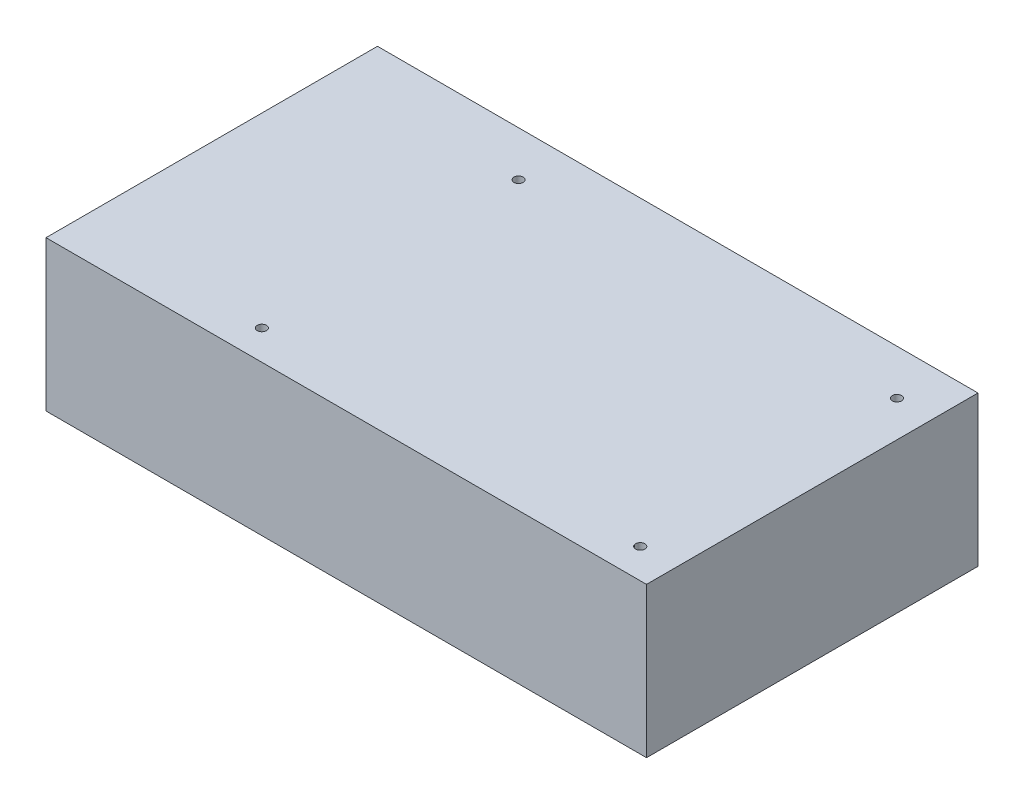
ISO-10303-21;
HEADER;
FILE_DESCRIPTION(('STEP AP214'),'2;1');
FILE_NAME('part.step','',(''),(''),'','','');
FILE_SCHEMA(('AUTOMOTIVE_DESIGN { 1 0 10303 214 1 1 1 1 }'));
ENDSEC;
DATA;
#1=APPLICATION_CONTEXT('core data for automotive mechanical design processes');
#2=APPLICATION_PROTOCOL_DEFINITION('international standard','automotive_design',2000,#1);
#3=PRODUCT_CONTEXT('',#1,'mechanical');
#4=PRODUCT('Part','Part','',(#3));
#5=PRODUCT_RELATED_PRODUCT_CATEGORY('part','',(#4));
#6=PRODUCT_DEFINITION_FORMATION('','',#4);
#7=PRODUCT_DEFINITION_CONTEXT('part definition',#1,'design');
#8=PRODUCT_DEFINITION('design','',#6,#7);
#9=PRODUCT_DEFINITION_SHAPE('','',#8);
#10=(LENGTH_UNIT() NAMED_UNIT(*) SI_UNIT(.MILLI.,.METRE.));
#11=(NAMED_UNIT(*) PLANE_ANGLE_UNIT() SI_UNIT($,.RADIAN.));
#12=(NAMED_UNIT(*) SI_UNIT($,.STERADIAN.) SOLID_ANGLE_UNIT());
#13=UNCERTAINTY_MEASURE_WITH_UNIT(LENGTH_MEASURE(1.E-05),#10,'distance_accuracy_value','');
#14=(GEOMETRIC_REPRESENTATION_CONTEXT(3) GLOBAL_UNCERTAINTY_ASSIGNED_CONTEXT((#13)) GLOBAL_UNIT_ASSIGNED_CONTEXT((#10,
#11,#12)) REPRESENTATION_CONTEXT('',''));
#15=CARTESIAN_POINT('',(0.,0.,0.));
#16=DIRECTION('',(0.,0.,1.));
#17=DIRECTION('',(1.,0.,0.));
#18=AXIS2_PLACEMENT_3D('',#15,#16,#17);
#19=CARTESIAN_POINT('',(0.,50.,0.));
#20=DIRECTION('',(1.,0.,0.));
#21=DIRECTION('',(0.,0.,-1.));
#22=AXIS2_PLACEMENT_3D('',#19,#20,#21);
#23=PLANE('',#22);
#24=DIRECTION('',(0.,0.,1.));
#25=VECTOR('',#24,1.);
#26=CARTESIAN_POINT('',(0.,0.,0.));
#27=LINE('',#26,#25);
#28=CARTESIAN_POINT('',(0.,0.,-110.4));
#29=VERTEX_POINT('',#28);
#30=CARTESIAN_POINT('',(0.,0.,0.));
#31=VERTEX_POINT('',#30);
#32=EDGE_CURVE('E98',#29,#31,#27,.T.);
#33=ORIENTED_EDGE('',*,*,#32,.T.);
#34=DIRECTION('',(0.,-1.,0.));
#35=VECTOR('',#34,1.);
#36=CARTESIAN_POINT('',(0.,50.,0.));
#37=LINE('',#36,#35);
#38=CARTESIAN_POINT('',(0.,50.,0.));
#39=VERTEX_POINT('',#38);
#40=EDGE_CURVE('E11',#39,#31,#37,.T.);
#41=ORIENTED_EDGE('',*,*,#40,.F.);
#42=DIRECTION('',(0.,0.,1.));
#43=VECTOR('',#42,1.);
#44=CARTESIAN_POINT('',(0.,50.,0.));
#45=LINE('',#44,#43);
#46=CARTESIAN_POINT('',(0.,50.,-110.4));
#47=VERTEX_POINT('',#46);
#48=EDGE_CURVE('E86',#47,#39,#45,.T.);
#49=ORIENTED_EDGE('',*,*,#48,.F.);
#50=DIRECTION('',(0.,-1.,0.));
#51=VECTOR('',#50,1.);
#52=CARTESIAN_POINT('',(0.,50.,-110.4));
#53=LINE('',#52,#51);
#54=EDGE_CURVE('E94',#47,#29,#53,.T.);
#55=ORIENTED_EDGE('',*,*,#54,.T.);
#56=EDGE_LOOP('',(#33,#41,#49,#55));
#57=FACE_BOUND('',#56,.T.);
#58=ADVANCED_FACE('F35',(#57),#23,.F.);
#59=CARTESIAN_POINT('',(0.,50.,0.));
#60=DIRECTION('',(0.,0.,-1.));
#61=DIRECTION('',(-1.,0.,0.));
#62=AXIS2_PLACEMENT_3D('',#59,#60,#61);
#63=PLANE('',#62);
#64=DIRECTION('',(1.,0.,0.));
#65=VECTOR('',#64,1.);
#66=CARTESIAN_POINT('',(0.,0.,0.));
#67=LINE('',#66,#65);
#68=CARTESIAN_POINT('',(200.,0.,0.));
#69=VERTEX_POINT('',#68);
#70=EDGE_CURVE('E90',#31,#69,#67,.T.);
#71=ORIENTED_EDGE('',*,*,#70,.T.);
#72=DIRECTION('',(0.,-1.,0.));
#73=VECTOR('',#72,1.);
#74=CARTESIAN_POINT('',(200.,50.,0.));
#75=LINE('',#74,#73);
#76=CARTESIAN_POINT('',(200.,50.,0.));
#77=VERTEX_POINT('',#76);
#78=EDGE_CURVE('E43',#77,#69,#75,.T.);
#79=ORIENTED_EDGE('',*,*,#78,.F.);
#80=DIRECTION('',(1.,0.,0.));
#81=VECTOR('',#80,1.);
#82=CARTESIAN_POINT('',(0.,50.,0.));
#83=LINE('',#82,#81);
#84=EDGE_CURVE('E81',#39,#77,#83,.T.);
#85=ORIENTED_EDGE('',*,*,#84,.F.);
#86=ORIENTED_EDGE('',*,*,#40,.T.);
#87=EDGE_LOOP('',(#71,#79,#85,#86));
#88=FACE_BOUND('',#87,.T.);
#89=ADVANCED_FACE('F89',(#88),#63,.F.);
#90=CARTESIAN_POINT('',(200.,50.,0.));
#91=DIRECTION('',(-1.,0.,0.));
#92=DIRECTION('',(0.,0.,1.));
#93=AXIS2_PLACEMENT_3D('',#90,#91,#92);
#94=PLANE('',#93);
#95=DIRECTION('',(0.,0.,-1.));
#96=VECTOR('',#95,1.);
#97=CARTESIAN_POINT('',(200.,0.,0.));
#98=LINE('',#97,#96);
#99=CARTESIAN_POINT('',(200.,0.,-110.4));
#100=VERTEX_POINT('',#99);
#101=EDGE_CURVE('E68',#69,#100,#98,.T.);
#102=ORIENTED_EDGE('',*,*,#101,.T.);
#103=DIRECTION('',(0.,-1.,0.));
#104=VECTOR('',#103,1.);
#105=CARTESIAN_POINT('',(200.,50.,-110.4));
#106=LINE('',#105,#104);
#107=CARTESIAN_POINT('',(200.,50.,-110.4));
#108=VERTEX_POINT('',#107);
#109=EDGE_CURVE('E91',#108,#100,#106,.T.);
#110=ORIENTED_EDGE('',*,*,#109,.F.);
#111=DIRECTION('',(0.,0.,-1.));
#112=VECTOR('',#111,1.);
#113=CARTESIAN_POINT('',(200.,50.,0.));
#114=LINE('',#113,#112);
#115=EDGE_CURVE('E84',#77,#108,#114,.T.);
#116=ORIENTED_EDGE('',*,*,#115,.F.);
#117=ORIENTED_EDGE('',*,*,#78,.T.);
#118=EDGE_LOOP('',(#102,#110,#116,#117));
#119=FACE_BOUND('',#118,.T.);
#120=ADVANCED_FACE('F92',(#119),#94,.F.);
#121=CARTESIAN_POINT('',(0.,50.,-110.4));
#122=DIRECTION('',(0.,0.,1.));
#123=DIRECTION('',(1.,0.,0.));
#124=AXIS2_PLACEMENT_3D('',#121,#122,#123);
#125=PLANE('',#124);
#126=DIRECTION('',(-1.,0.,0.));
#127=VECTOR('',#126,1.);
#128=CARTESIAN_POINT('',(0.,0.,-110.4));
#129=LINE('',#128,#127);
#130=EDGE_CURVE('E74',#100,#29,#129,.T.);
#131=ORIENTED_EDGE('',*,*,#130,.T.);
#132=ORIENTED_EDGE('',*,*,#54,.F.);
#133=DIRECTION('',(-1.,0.,0.));
#134=VECTOR('',#133,1.);
#135=CARTESIAN_POINT('',(0.,50.,-110.4));
#136=LINE('',#135,#134);
#137=EDGE_CURVE('E51',#108,#47,#136,.T.);
#138=ORIENTED_EDGE('',*,*,#137,.F.);
#139=ORIENTED_EDGE('',*,*,#109,.T.);
#140=EDGE_LOOP('',(#131,#132,#138,#139));
#141=FACE_BOUND('',#140,.T.);
#142=ADVANCED_FACE('F106',(#141),#125,.F.);
#143=CARTESIAN_POINT('',(0.,50.,0.));
#144=DIRECTION('',(0.,-1.,0.));
#145=DIRECTION('',(0.,0.,-1.));
#146=AXIS2_PLACEMENT_3D('',#143,#144,#145);
#147=PLANE('',#146);
#148=CARTESIAN_POINT('',(62.0000000000009,50.,-9.89999999999999));
#149=DIRECTION('',(0.,1.,0.));
#150=DIRECTION('',(0.,0.,1.));
#151=AXIS2_PLACEMENT_3D('',#148,#149,#150);
#152=CIRCLE('',#151,1.55);
#153=CARTESIAN_POINT('',(62.0000000000009,50.,-8.34999999999999));
#154=VERTEX_POINT('',#153);
#155=EDGE_CURVE('E118',#154,#154,#152,.T.);
#156=ORIENTED_EDGE('',*,*,#155,.F.);
#157=EDGE_LOOP('',(#156));
#158=FACE_BOUND('',#157,.T.);
#159=CARTESIAN_POINT('',(188.000000000001,50.,-9.89999999999999));
#160=DIRECTION('',(0.,1.,0.));
#161=DIRECTION('',(0.,0.,1.));
#162=AXIS2_PLACEMENT_3D('',#159,#160,#161);
#163=CIRCLE('',#162,1.54999999999999);
#164=CARTESIAN_POINT('',(188.000000000001,50.,-8.35));
#165=VERTEX_POINT('',#164);
#166=EDGE_CURVE('E124',#165,#165,#163,.T.);
#167=ORIENTED_EDGE('',*,*,#166,.F.);
#168=EDGE_LOOP('',(#167));
#169=FACE_BOUND('',#168,.T.);
#170=CARTESIAN_POINT('',(188.,50.,-95.4));
#171=DIRECTION('',(0.,1.,0.));
#172=DIRECTION('',(0.,0.,1.));
#173=AXIS2_PLACEMENT_3D('',#170,#171,#172);
#174=CIRCLE('',#173,1.54999999999999);
#175=CARTESIAN_POINT('',(188.,50.,-93.85));
#176=VERTEX_POINT('',#175);
#177=EDGE_CURVE('E130',#176,#176,#174,.T.);
#178=ORIENTED_EDGE('',*,*,#177,.F.);
#179=EDGE_LOOP('',(#178));
#180=FACE_BOUND('',#179,.T.);
#181=CARTESIAN_POINT('',(62.,50.,-95.4));
#182=DIRECTION('',(0.,1.,0.));
#183=DIRECTION('',(0.,0.,1.));
#184=AXIS2_PLACEMENT_3D('',#181,#182,#183);
#185=CIRCLE('',#184,1.54999999999999);
#186=CARTESIAN_POINT('',(62.,50.,-93.85));
#187=VERTEX_POINT('',#186);
#188=EDGE_CURVE('E112',#187,#187,#185,.T.);
#189=ORIENTED_EDGE('',*,*,#188,.F.);
#190=EDGE_LOOP('',(#189));
#191=FACE_BOUND('',#190,.T.);
#192=ORIENTED_EDGE('',*,*,#48,.T.);
#193=ORIENTED_EDGE('',*,*,#84,.T.);
#194=ORIENTED_EDGE('',*,*,#115,.T.);
#195=ORIENTED_EDGE('',*,*,#137,.T.);
#196=EDGE_LOOP('',(#192,#193,#194,#195));
#197=FACE_BOUND('',#196,.T.);
#198=ADVANCED_FACE('F82',(#158,#169,#180,#191,#197),#147,.F.);
#199=CARTESIAN_POINT('',(0.,0.,0.));
#200=DIRECTION('',(0.,-1.,0.));
#201=DIRECTION('',(0.,0.,-1.));
#202=AXIS2_PLACEMENT_3D('',#199,#200,#201);
#203=PLANE('',#202);
#204=ORIENTED_EDGE('',*,*,#32,.F.);
#205=ORIENTED_EDGE('',*,*,#130,.F.);
#206=ORIENTED_EDGE('',*,*,#101,.F.);
#207=ORIENTED_EDGE('',*,*,#70,.F.);
#208=EDGE_LOOP('',(#204,#205,#206,#207));
#209=FACE_BOUND('',#208,.T.);
#210=ADVANCED_FACE('F109',(#209),#203,.T.);
#211=CARTESIAN_POINT('',(62.,40.,-95.4));
#212=DIRECTION('',(0.,1.,0.));
#213=DIRECTION('',(0.,0.,1.));
#214=AXIS2_PLACEMENT_3D('',#211,#212,#213);
#215=CYLINDRICAL_SURFACE('',#214,1.54999999999999);
#216=CARTESIAN_POINT('',(62.,40.,-95.4));
#217=DIRECTION('',(0.,1.,0.));
#218=DIRECTION('',(0.,0.,1.));
#219=AXIS2_PLACEMENT_3D('',#216,#217,#218);
#220=CIRCLE('',#219,1.54999999999999);
#221=CARTESIAN_POINT('',(62.,40.,-93.85));
#222=VERTEX_POINT('',#221);
#223=EDGE_CURVE('E101',#222,#222,#220,.T.);
#224=ORIENTED_EDGE('',*,*,#223,.F.);
#225=EDGE_LOOP('',(#224));
#226=FACE_BOUND('',#225,.T.);
#227=ORIENTED_EDGE('',*,*,#188,.T.);
#228=EDGE_LOOP('',(#227));
#229=FACE_BOUND('',#228,.T.);
#230=ADVANCED_FACE('F151',(#226,#229),#215,.F.);
#231=CARTESIAN_POINT('',(62.,40.,-95.4));
#232=DIRECTION('',(0.,1.,0.));
#233=DIRECTION('',(0.,0.,1.));
#234=AXIS2_PLACEMENT_3D('',#231,#232,#233);
#235=PLANE('',#234);
#236=ORIENTED_EDGE('',*,*,#223,.T.);
#237=EDGE_LOOP('',(#236));
#238=FACE_BOUND('',#237,.T.);
#239=ADVANCED_FACE('F141',(#238),#235,.T.);
#240=CARTESIAN_POINT('',(188.,40.,-95.4));
#241=DIRECTION('',(0.,1.,0.));
#242=DIRECTION('',(0.,0.,1.));
#243=AXIS2_PLACEMENT_3D('',#240,#241,#242);
#244=CYLINDRICAL_SURFACE('',#243,1.54999999999999);
#245=CARTESIAN_POINT('',(188.,40.,-95.4));
#246=DIRECTION('',(0.,1.,0.));
#247=DIRECTION('',(0.,0.,1.));
#248=AXIS2_PLACEMENT_3D('',#245,#246,#247);
#249=CIRCLE('',#248,1.54999999999999);
#250=CARTESIAN_POINT('',(188.,40.,-93.85));
#251=VERTEX_POINT('',#250);
#252=EDGE_CURVE('E115',#251,#251,#249,.T.);
#253=ORIENTED_EDGE('',*,*,#252,.F.);
#254=EDGE_LOOP('',(#253));
#255=FACE_BOUND('',#254,.T.);
#256=ORIENTED_EDGE('',*,*,#177,.T.);
#257=EDGE_LOOP('',(#256));
#258=FACE_BOUND('',#257,.T.);
#259=ADVANCED_FACE('F138',(#255,#258),#244,.F.);
#260=CARTESIAN_POINT('',(188.,40.,-95.4));
#261=DIRECTION('',(0.,1.,0.));
#262=DIRECTION('',(0.,0.,1.));
#263=AXIS2_PLACEMENT_3D('',#260,#261,#262);
#264=PLANE('',#263);
#265=ORIENTED_EDGE('',*,*,#252,.T.);
#266=EDGE_LOOP('',(#265));
#267=FACE_BOUND('',#266,.T.);
#268=ADVANCED_FACE('F136',(#267),#264,.T.);
#269=CARTESIAN_POINT('',(188.000000000001,40.,-9.89999999999999));
#270=DIRECTION('',(0.,1.,0.));
#271=DIRECTION('',(0.,0.,1.));
#272=AXIS2_PLACEMENT_3D('',#269,#270,#271);
#273=CYLINDRICAL_SURFACE('',#272,1.54999999999999);
#274=CARTESIAN_POINT('',(188.000000000001,40.,-9.89999999999999));
#275=DIRECTION('',(0.,1.,0.));
#276=DIRECTION('',(0.,0.,1.));
#277=AXIS2_PLACEMENT_3D('',#274,#275,#276);
#278=CIRCLE('',#277,1.54999999999999);
#279=CARTESIAN_POINT('',(188.000000000001,40.,-8.35));
#280=VERTEX_POINT('',#279);
#281=EDGE_CURVE('E127',#280,#280,#278,.T.);
#282=ORIENTED_EDGE('',*,*,#281,.F.);
#283=EDGE_LOOP('',(#282));
#284=FACE_BOUND('',#283,.T.);
#285=ORIENTED_EDGE('',*,*,#166,.T.);
#286=EDGE_LOOP('',(#285));
#287=FACE_BOUND('',#286,.T.);
#288=ADVANCED_FACE('F211',(#284,#287),#273,.F.);
#289=CARTESIAN_POINT('',(188.000000000001,40.,-9.89999999999999));
#290=DIRECTION('',(0.,1.,0.));
#291=DIRECTION('',(0.,0.,1.));
#292=AXIS2_PLACEMENT_3D('',#289,#290,#291);
#293=PLANE('',#292);
#294=ORIENTED_EDGE('',*,*,#281,.T.);
#295=EDGE_LOOP('',(#294));
#296=FACE_BOUND('',#295,.T.);
#297=ADVANCED_FACE('F219',(#296),#293,.T.);
#298=CARTESIAN_POINT('',(62.0000000000009,40.,-9.89999999999999));
#299=DIRECTION('',(0.,1.,0.));
#300=DIRECTION('',(0.,0.,1.));
#301=AXIS2_PLACEMENT_3D('',#298,#299,#300);
#302=CYLINDRICAL_SURFACE('',#301,1.55);
#303=CARTESIAN_POINT('',(62.0000000000009,40.,-9.89999999999999));
#304=DIRECTION('',(0.,1.,0.));
#305=DIRECTION('',(0.,0.,1.));
#306=AXIS2_PLACEMENT_3D('',#303,#304,#305);
#307=CIRCLE('',#306,1.55);
#308=CARTESIAN_POINT('',(62.0000000000009,40.,-8.34999999999999));
#309=VERTEX_POINT('',#308);
#310=EDGE_CURVE('E121',#309,#309,#307,.T.);
#311=ORIENTED_EDGE('',*,*,#310,.F.);
#312=EDGE_LOOP('',(#311));
#313=FACE_BOUND('',#312,.T.);
#314=ORIENTED_EDGE('',*,*,#155,.T.);
#315=EDGE_LOOP('',(#314));
#316=FACE_BOUND('',#315,.T.);
#317=ADVANCED_FACE('F228',(#313,#316),#302,.F.);
#318=CARTESIAN_POINT('',(62.0000000000009,40.,-9.89999999999999));
#319=DIRECTION('',(0.,1.,0.));
#320=DIRECTION('',(0.,0.,1.));
#321=AXIS2_PLACEMENT_3D('',#318,#319,#320);
#322=PLANE('',#321);
#323=ORIENTED_EDGE('',*,*,#310,.T.);
#324=EDGE_LOOP('',(#323));
#325=FACE_BOUND('',#324,.T.);
#326=ADVANCED_FACE('F237',(#325),#322,.T.);
#327=CLOSED_SHELL('',(#58,#89,#120,#142,#198,#210,#230,#239,#259,#268,#288,#297,#317,#326));
#328=MANIFOLD_SOLID_BREP('B2',#327);
#329=ADVANCED_BREP_SHAPE_REPRESENTATION('',(#18,#328),#14);
#330=SHAPE_DEFINITION_REPRESENTATION(#9,#329);
ENDSEC;
END-ISO-10303-21;
